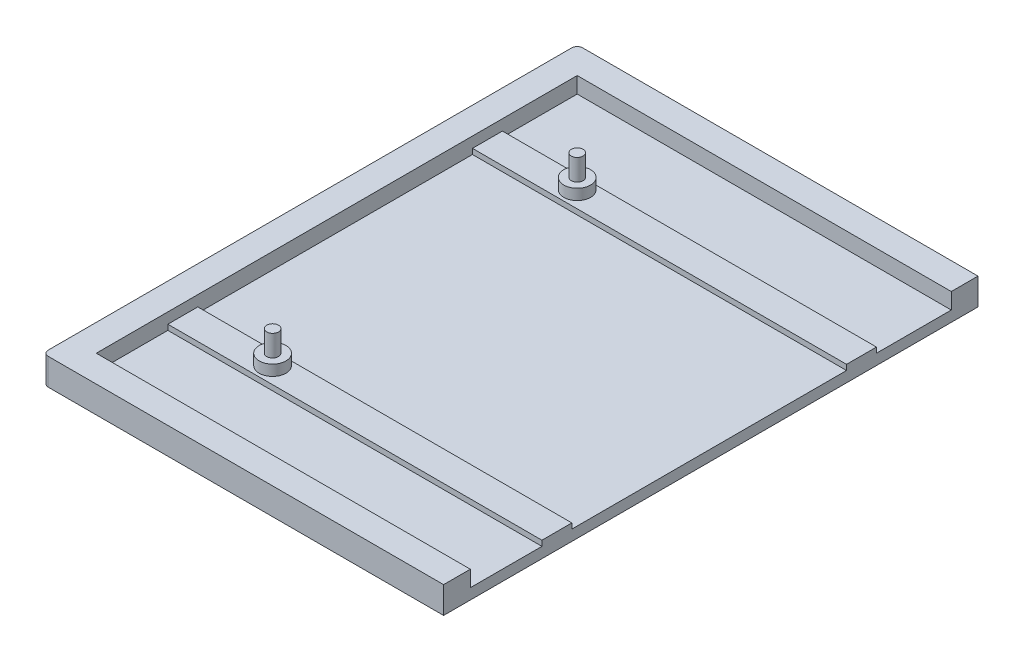
ISO-10303-21;
HEADER;
FILE_DESCRIPTION(('STEP AP214'),'2;1');
FILE_NAME('part.step','',(''),(''),'','','');
FILE_SCHEMA(('AUTOMOTIVE_DESIGN { 1 0 10303 214 1 1 1 1 }'));
ENDSEC;
DATA;
#1=APPLICATION_CONTEXT('core data for automotive mechanical design processes');
#2=APPLICATION_PROTOCOL_DEFINITION('international standard','automotive_design',2000,#1);
#3=PRODUCT_CONTEXT('',#1,'mechanical');
#4=PRODUCT('Part','Part','',(#3));
#5=PRODUCT_RELATED_PRODUCT_CATEGORY('part','',(#4));
#6=PRODUCT_DEFINITION_FORMATION('','',#4);
#7=PRODUCT_DEFINITION_CONTEXT('part definition',#1,'design');
#8=PRODUCT_DEFINITION('design','',#6,#7);
#9=PRODUCT_DEFINITION_SHAPE('','',#8);
#10=(LENGTH_UNIT() NAMED_UNIT(*) SI_UNIT(.MILLI.,.METRE.));
#11=(NAMED_UNIT(*) PLANE_ANGLE_UNIT() SI_UNIT($,.RADIAN.));
#12=(NAMED_UNIT(*) SI_UNIT($,.STERADIAN.) SOLID_ANGLE_UNIT());
#13=UNCERTAINTY_MEASURE_WITH_UNIT(LENGTH_MEASURE(1.E-05),#10,'distance_accuracy_value','');
#14=(GEOMETRIC_REPRESENTATION_CONTEXT(3) GLOBAL_UNCERTAINTY_ASSIGNED_CONTEXT((#13)) GLOBAL_UNIT_ASSIGNED_CONTEXT((#10,
#11,#12)) REPRESENTATION_CONTEXT('',''));
#15=CARTESIAN_POINT('',(0.,0.,0.));
#16=DIRECTION('',(0.,0.,1.));
#17=DIRECTION('',(1.,0.,0.));
#18=AXIS2_PLACEMENT_3D('',#15,#16,#17);
#19=CARTESIAN_POINT('',(124.126441540026,0.,0.));
#20=DIRECTION('',(-1.,0.,0.));
#21=DIRECTION('',(0.,0.,1.));
#22=AXIS2_PLACEMENT_3D('',#19,#20,#21);
#23=PLANE('',#22);
#24=DIRECTION('',(0.,-1.,0.));
#25=VECTOR('',#24,1.);
#26=CARTESIAN_POINT('',(124.126441540026,5.,-248.405238280515));
#27=LINE('',#26,#25);
#28=CARTESIAN_POINT('',(124.126441540026,5.,-248.405238280515));
#29=VERTEX_POINT('',#28);
#30=CARTESIAN_POINT('',(124.126441540026,0.,-248.405238280515));
#31=VERTEX_POINT('',#30);
#32=EDGE_CURVE('E313',#29,#31,#27,.T.);
#33=ORIENTED_EDGE('',*,*,#32,.F.);
#34=DIRECTION('',(0.,0.,1.));
#35=VECTOR('',#34,1.);
#36=CARTESIAN_POINT('',(124.126441540026,5.,0.));
#37=LINE('',#36,#35);
#38=CARTESIAN_POINT('',(124.126441540026,5.,-243.405238280515));
#39=VERTEX_POINT('',#38);
#40=EDGE_CURVE('E309',#29,#39,#37,.T.);
#41=ORIENTED_EDGE('',*,*,#40,.T.);
#42=DIRECTION('',(0.,-1.,0.));
#43=VECTOR('',#42,1.);
#44=CARTESIAN_POINT('',(124.126441540026,5.,-243.405238280515));
#45=LINE('',#44,#43);
#46=CARTESIAN_POINT('',(124.126441540026,2.,-243.405238280515));
#47=VERTEX_POINT('',#46);
#48=EDGE_CURVE('E306',#39,#47,#45,.T.);
#49=ORIENTED_EDGE('',*,*,#48,.T.);
#50=DIRECTION('',(0.,0.,1.));
#51=VECTOR('',#50,1.);
#52=CARTESIAN_POINT('',(124.126441540026,2.,0.));
#53=LINE('',#52,#51);
#54=CARTESIAN_POINT('',(124.126441540026,2.,-229.405435317784));
#55=VERTEX_POINT('',#54);
#56=EDGE_CURVE('E302',#47,#55,#53,.T.);
#57=ORIENTED_EDGE('',*,*,#56,.T.);
#58=DIRECTION('',(0.,-1.,0.));
#59=VECTOR('',#58,1.);
#60=CARTESIAN_POINT('',(124.126441540026,3.,-229.405435317784));
#61=LINE('',#60,#59);
#62=CARTESIAN_POINT('',(124.126441540026,3.,-229.405435317784));
#63=VERTEX_POINT('',#62);
#64=EDGE_CURVE('E292',#63,#55,#61,.T.);
#65=ORIENTED_EDGE('',*,*,#64,.F.);
#66=DIRECTION('',(0.,0.,-1.));
#67=VECTOR('',#66,1.);
#68=CARTESIAN_POINT('',(124.126441540026,3.,0.));
#69=LINE('',#68,#67);
#70=CARTESIAN_POINT('',(124.126441540026,3.,-223.805428582459));
#71=VERTEX_POINT('',#70);
#72=EDGE_CURVE('E293',#71,#63,#69,.T.);
#73=ORIENTED_EDGE('',*,*,#72,.F.);
#74=DIRECTION('',(0.,1.,0.));
#75=VECTOR('',#74,1.);
#76=CARTESIAN_POINT('',(124.126441540026,3.,-223.805428582459));
#77=LINE('',#76,#75);
#78=CARTESIAN_POINT('',(124.126441540026,2.,-223.805428582459));
#79=VERTEX_POINT('',#78);
#80=EDGE_CURVE('E286',#79,#71,#77,.T.);
#81=ORIENTED_EDGE('',*,*,#80,.F.);
#82=DIRECTION('',(0.,0.,1.));
#83=VECTOR('',#82,1.);
#84=CARTESIAN_POINT('',(124.126441540026,2.,0.));
#85=LINE('',#84,#83);
#86=CARTESIAN_POINT('',(124.126441540026,2.,-172.405304582281));
#87=VERTEX_POINT('',#86);
#88=EDGE_CURVE('E11',#79,#87,#85,.T.);
#89=ORIENTED_EDGE('',*,*,#88,.T.);
#90=DIRECTION('',(0.,-1.,0.));
#91=VECTOR('',#90,1.);
#92=CARTESIAN_POINT('',(124.126441540026,3.,-172.405304582281));
#93=LINE('',#92,#91);
#94=CARTESIAN_POINT('',(124.126441540026,3.,-172.405304582281));
#95=VERTEX_POINT('',#94);
#96=EDGE_CURVE('E59',#95,#87,#93,.T.);
#97=ORIENTED_EDGE('',*,*,#96,.F.);
#98=DIRECTION('',(0.,0.,-1.));
#99=VECTOR('',#98,1.);
#100=CARTESIAN_POINT('',(124.126441540026,3.,0.));
#101=LINE('',#100,#99);
#102=CARTESIAN_POINT('',(124.126441540026,3.,-166.805313068658));
#103=VERTEX_POINT('',#102);
#104=EDGE_CURVE('E174',#103,#95,#101,.T.);
#105=ORIENTED_EDGE('',*,*,#104,.F.);
#106=DIRECTION('',(0.,1.,0.));
#107=VECTOR('',#106,1.);
#108=CARTESIAN_POINT('',(124.126441540026,3.,-166.805313068658));
#109=LINE('',#108,#107);
#110=CARTESIAN_POINT('',(124.126441540026,2.,-166.805313068658));
#111=VERTEX_POINT('',#110);
#112=EDGE_CURVE('E296',#111,#103,#109,.T.);
#113=ORIENTED_EDGE('',*,*,#112,.F.);
#114=DIRECTION('',(0.,0.,1.));
#115=VECTOR('',#114,1.);
#116=CARTESIAN_POINT('',(124.126441540026,2.,0.));
#117=LINE('',#116,#115);
#118=CARTESIAN_POINT('',(124.126441540026,2.,-153.405153415137));
#119=VERTEX_POINT('',#118);
#120=EDGE_CURVE('E45',#111,#119,#117,.T.);
#121=ORIENTED_EDGE('',*,*,#120,.T.);
#122=DIRECTION('',(0.,1.,0.));
#123=VECTOR('',#122,1.);
#124=CARTESIAN_POINT('',(124.126441540026,5.,-153.405153415137));
#125=LINE('',#124,#123);
#126=CARTESIAN_POINT('',(124.126441540026,5.,-153.405153415137));
#127=VERTEX_POINT('',#126);
#128=EDGE_CURVE('E310',#119,#127,#125,.T.);
#129=ORIENTED_EDGE('',*,*,#128,.T.);
#130=CARTESIAN_POINT('',(124.126441540026,5.,-148.405152672559));
#131=VERTEX_POINT('',#130);
#132=EDGE_CURVE('E305',#127,#131,#37,.T.);
#133=ORIENTED_EDGE('',*,*,#132,.T.);
#134=DIRECTION('',(0.,1.,0.));
#135=VECTOR('',#134,1.);
#136=CARTESIAN_POINT('',(124.126441540026,5.,-148.405152672559));
#137=LINE('',#136,#135);
#138=CARTESIAN_POINT('',(124.126441540026,0.,-148.405152672559));
#139=VERTEX_POINT('',#138);
#140=EDGE_CURVE('E316',#139,#131,#137,.T.);
#141=ORIENTED_EDGE('',*,*,#140,.F.);
#142=DIRECTION('',(0.,0.,1.));
#143=VECTOR('',#142,1.);
#144=CARTESIAN_POINT('',(124.126441540026,0.,0.));
#145=LINE('',#144,#143);
#146=EDGE_CURVE('E40',#31,#139,#145,.T.);
#147=ORIENTED_EDGE('',*,*,#146,.F.);
#148=EDGE_LOOP('',(#33,#41,#49,#57,#65,#73,#81,#89,#97,#105,#113,#121,#129,#133,#141,#147));
#149=FACE_BOUND('',#148,.T.);
#150=ADVANCED_FACE('F37',(#149),#23,.F.);
#151=CARTESIAN_POINT('',(0.,5.,-148.405152672559));
#152=DIRECTION('',(0.,0.,-1.));
#153=DIRECTION('',(-1.,0.,0.));
#154=AXIS2_PLACEMENT_3D('',#151,#152,#153);
#155=PLANE('',#154);
#156=DIRECTION('',(1.,0.,0.));
#157=VECTOR('',#156,1.);
#158=CARTESIAN_POINT('',(0.,0.,-148.405152672559));
#159=LINE('',#158,#157);
#160=CARTESIAN_POINT('',(50.1424415400261,0.,-148.405152672559));
#161=VERTEX_POINT('',#160);
#162=EDGE_CURVE('E267',#161,#139,#159,.T.);
#163=ORIENTED_EDGE('',*,*,#162,.T.);
#164=ORIENTED_EDGE('',*,*,#140,.T.);
#165=DIRECTION('',(1.,0.,0.));
#166=VECTOR('',#165,1.);
#167=CARTESIAN_POINT('',(0.,5.,-148.405152672559));
#168=LINE('',#167,#166);
#169=CARTESIAN_POINT('',(50.1424415400261,5.,-148.405152672559));
#170=VERTEX_POINT('',#169);
#171=EDGE_CURVE('E255',#170,#131,#168,.T.);
#172=ORIENTED_EDGE('',*,*,#171,.F.);
#173=DIRECTION('',(0.,-1.,0.));
#174=VECTOR('',#173,1.);
#175=CARTESIAN_POINT('',(50.1424415400261,5.,-148.405152672559));
#176=LINE('',#175,#174);
#177=EDGE_CURVE('E280',#170,#161,#176,.T.);
#178=ORIENTED_EDGE('',*,*,#177,.T.);
#179=EDGE_LOOP('',(#163,#164,#172,#178));
#180=FACE_BOUND('',#179,.T.);
#181=ADVANCED_FACE('F386',(#180),#155,.F.);
#182=CARTESIAN_POINT('',(0.,5.,-153.405153415137));
#183=DIRECTION('',(0.,0.,-1.));
#184=DIRECTION('',(-1.,0.,0.));
#185=AXIS2_PLACEMENT_3D('',#182,#183,#184);
#186=PLANE('',#185);
#187=ORIENTED_EDGE('',*,*,#128,.F.);
#188=DIRECTION('',(1.,0.,0.));
#189=VECTOR('',#188,1.);
#190=CARTESIAN_POINT('',(0.,2.,-153.405153415137));
#191=LINE('',#190,#189);
#192=CARTESIAN_POINT('',(54.1264415400261,2.,-153.405153415137));
#193=VERTEX_POINT('',#192);
#194=EDGE_CURVE('E217',#193,#119,#191,.T.);
#195=ORIENTED_EDGE('',*,*,#194,.F.);
#196=DIRECTION('',(0.,-1.,0.));
#197=VECTOR('',#196,1.);
#198=CARTESIAN_POINT('',(54.1264415400261,5.,-153.405153415137));
#199=LINE('',#198,#197);
#200=CARTESIAN_POINT('',(54.1264415400261,5.,-153.405153415137));
#201=VERTEX_POINT('',#200);
#202=EDGE_CURVE('E277',#201,#193,#199,.T.);
#203=ORIENTED_EDGE('',*,*,#202,.F.);
#204=DIRECTION('',(1.,0.,0.));
#205=VECTOR('',#204,1.);
#206=CARTESIAN_POINT('',(0.,5.,-153.405153415137));
#207=LINE('',#206,#205);
#208=EDGE_CURVE('E241',#201,#127,#207,.T.);
#209=ORIENTED_EDGE('',*,*,#208,.T.);
#210=EDGE_LOOP('',(#187,#195,#203,#209));
#211=FACE_BOUND('',#210,.T.);
#212=ADVANCED_FACE('F382',(#211),#186,.T.);
#213=CARTESIAN_POINT('',(0.,5.,0.));
#214=DIRECTION('',(0.,1.,0.));
#215=DIRECTION('',(0.,0.,1.));
#216=AXIS2_PLACEMENT_3D('',#213,#214,#215);
#217=PLANE('',#216);
#218=ORIENTED_EDGE('',*,*,#40,.F.);
#219=DIRECTION('',(-1.,0.,1.90461469313681E-08));
#220=VECTOR('',#219,1.);
#221=CARTESIAN_POINT('',(-4.73116262178461E-06,5.,-248.405235916384));
#222=LINE('',#221,#220);
#223=CARTESIAN_POINT('',(50.1424408346779,5.,-248.405236871404));
#224=VERTEX_POINT('',#223);
#225=EDGE_CURVE('E258',#29,#224,#222,.T.);
#226=ORIENTED_EDGE('',*,*,#225,.T.);
#227=CARTESIAN_POINT('',(50.1424415400093,5.,-247.389236871405));
#228=DIRECTION('',(0.,1.,0.));
#229=DIRECTION('',(0.,0.,1.));
#230=AXIS2_PLACEMENT_3D('',#227,#228,#229);
#231=CIRCLE('',#230,1.01600000000002);
#232=CARTESIAN_POINT('',(49.1264415400261,5.,-247.389242717958));
#233=VERTEX_POINT('',#232);
#234=EDGE_CURVE('E260',#224,#233,#231,.T.);
#235=ORIENTED_EDGE('',*,*,#234,.T.);
#236=DIRECTION('',(0.,0.,1.));
#237=VECTOR('',#236,1.);
#238=CARTESIAN_POINT('',(49.1264415400262,5.,0.));
#239=LINE('',#238,#237);
#240=CARTESIAN_POINT('',(49.1264415400261,5.,-149.421152672559));
#241=VERTEX_POINT('',#240);
#242=EDGE_CURVE('E250',#233,#241,#239,.T.);
#243=ORIENTED_EDGE('',*,*,#242,.T.);
#244=CARTESIAN_POINT('',(50.1424415400261,5.,-149.421152672559));
#245=DIRECTION('',(0.,1.,0.));
#246=DIRECTION('',(0.,0.,1.));
#247=AXIS2_PLACEMENT_3D('',#244,#245,#246);
#248=CIRCLE('',#247,1.01600000000002);
#249=EDGE_CURVE('E253',#241,#170,#248,.T.);
#250=ORIENTED_EDGE('',*,*,#249,.T.);
#251=ORIENTED_EDGE('',*,*,#171,.T.);
#252=ORIENTED_EDGE('',*,*,#132,.F.);
#253=ORIENTED_EDGE('',*,*,#208,.F.);
#254=DIRECTION('',(0.,0.,1.));
#255=VECTOR('',#254,1.);
#256=CARTESIAN_POINT('',(54.1264415400261,5.,0.));
#257=LINE('',#256,#255);
#258=CARTESIAN_POINT('',(54.1264415400261,5.,-243.405236947284));
#259=VERTEX_POINT('',#258);
#260=EDGE_CURVE('E244',#259,#201,#257,.T.);
#261=ORIENTED_EDGE('',*,*,#260,.F.);
#262=DIRECTION('',(-1.,0.,1.90461465885209E-08));
#263=VECTOR('',#262,1.);
#264=CARTESIAN_POINT('',(-4.63593180367697E-06,5.,-243.405235916384));
#265=LINE('',#264,#263);
#266=EDGE_CURVE('E248',#39,#259,#265,.T.);
#267=ORIENTED_EDGE('',*,*,#266,.F.);
#268=EDGE_LOOP('',(#218,#226,#235,#243,#250,#251,#252,#253,#261,#267));
#269=FACE_BOUND('',#268,.T.);
#270=ADVANCED_FACE('F341',(#269),#217,.T.);
#271=CARTESIAN_POINT('',(0.,0.,0.));
#272=DIRECTION('',(0.,1.,0.));
#273=DIRECTION('',(0.,0.,1.));
#274=AXIS2_PLACEMENT_3D('',#271,#272,#273);
#275=PLANE('',#274);
#276=DIRECTION('',(-1.,0.,1.90461469313681E-08));
#277=VECTOR('',#276,1.);
#278=CARTESIAN_POINT('',(-4.73116262178461E-06,0.,-248.405235916384));
#279=LINE('',#278,#277);
#280=CARTESIAN_POINT('',(50.1424408346779,0.,-248.405236871404));
#281=VERTEX_POINT('',#280);
#282=EDGE_CURVE('E270',#31,#281,#279,.T.);
#283=ORIENTED_EDGE('',*,*,#282,.F.);
#284=ORIENTED_EDGE('',*,*,#146,.T.);
#285=ORIENTED_EDGE('',*,*,#162,.F.);
#286=CARTESIAN_POINT('',(50.1424415400261,0.,-149.421152672559));
#287=DIRECTION('',(0.,1.,0.));
#288=DIRECTION('',(0.,0.,1.));
#289=AXIS2_PLACEMENT_3D('',#286,#287,#288);
#290=CIRCLE('',#289,1.01600000000002);
#291=CARTESIAN_POINT('',(49.1264415400261,0.,-149.421152672559));
#292=VERTEX_POINT('',#291);
#293=EDGE_CURVE('E265',#292,#161,#290,.T.);
#294=ORIENTED_EDGE('',*,*,#293,.F.);
#295=DIRECTION('',(0.,0.,1.));
#296=VECTOR('',#295,1.);
#297=CARTESIAN_POINT('',(49.1264415400262,0.,0.));
#298=LINE('',#297,#296);
#299=CARTESIAN_POINT('',(49.1264415400261,0.,-247.389242717958));
#300=VERTEX_POINT('',#299);
#301=EDGE_CURVE('E239',#300,#292,#298,.T.);
#302=ORIENTED_EDGE('',*,*,#301,.F.);
#303=CARTESIAN_POINT('',(50.1424415400093,0.,-247.389236871405));
#304=DIRECTION('',(0.,1.,0.));
#305=DIRECTION('',(0.,0.,1.));
#306=AXIS2_PLACEMENT_3D('',#303,#304,#305);
#307=CIRCLE('',#306,1.01600000000002);
#308=EDGE_CURVE('E245',#281,#300,#307,.T.);
#309=ORIENTED_EDGE('',*,*,#308,.F.);
#310=EDGE_LOOP('',(#283,#284,#285,#294,#302,#309));
#311=FACE_BOUND('',#310,.T.);
#312=ADVANCED_FACE('F328',(#311),#275,.F.);
#313=CARTESIAN_POINT('',(0.,3.,0.));
#314=DIRECTION('',(0.,-1.,0.));
#315=DIRECTION('',(0.,0.,-1.));
#316=AXIS2_PLACEMENT_3D('',#313,#314,#315);
#317=PLANE('',#316);
#318=DIRECTION('',(1.,0.,0.));
#319=VECTOR('',#318,1.);
#320=CARTESIAN_POINT('',(353.126212345323,3.,-166.805313068658));
#321=LINE('',#320,#319);
#322=CARTESIAN_POINT('',(54.1264415400261,3.,-166.805313068658));
#323=VERTEX_POINT('',#322);
#324=EDGE_CURVE('E191',#323,#103,#321,.T.);
#325=ORIENTED_EDGE('',*,*,#324,.T.);
#326=ORIENTED_EDGE('',*,*,#104,.T.);
#327=DIRECTION('',(-1.,0.,0.));
#328=VECTOR('',#327,1.);
#329=CARTESIAN_POINT('',(54.1264415400261,3.,-172.405304582281));
#330=LINE('',#329,#328);
#331=CARTESIAN_POINT('',(70.6262489401997,3.,-172.405304582281));
#332=VERTEX_POINT('',#331);
#333=EDGE_CURVE('E167',#95,#332,#330,.T.);
#334=ORIENTED_EDGE('',*,*,#333,.T.);
#335=CARTESIAN_POINT('',(70.6262489401997,3.,-169.905304582281));
#336=DIRECTION('',(0.,-1.,0.));
#337=DIRECTION('',(0.,0.,-1.));
#338=AXIS2_PLACEMENT_3D('',#335,#336,#337);
#339=CIRCLE('',#338,2.5);
#340=EDGE_CURVE('E172',#332,#332,#339,.F.);
#341=ORIENTED_EDGE('',*,*,#340,.F.);
#342=CARTESIAN_POINT('',(54.1264415400261,3.,-172.405304582281));
#343=VERTEX_POINT('',#342);
#344=EDGE_CURVE('E176',#332,#343,#330,.T.);
#345=ORIENTED_EDGE('',*,*,#344,.T.);
#346=DIRECTION('',(0.,0.,1.));
#347=VECTOR('',#346,1.);
#348=CARTESIAN_POINT('',(54.1264415400261,3.,-166.805313068658));
#349=LINE('',#348,#347);
#350=EDGE_CURVE('E175',#343,#323,#349,.T.);
#351=ORIENTED_EDGE('',*,*,#350,.T.);
#352=EDGE_LOOP('',(#325,#326,#334,#341,#345,#351));
#353=FACE_BOUND('',#352,.T.);
#354=ADVANCED_FACE('F170',(#353),#317,.F.);
#355=CARTESIAN_POINT('',(353.126212345323,3.,-166.805313068658));
#356=DIRECTION('',(0.,0.,-1.));
#357=DIRECTION('',(-1.,0.,0.));
#358=AXIS2_PLACEMENT_3D('',#355,#356,#357);
#359=PLANE('',#358);
#360=DIRECTION('',(1.,0.,0.));
#361=VECTOR('',#360,1.);
#362=CARTESIAN_POINT('',(353.126212345323,2.,-166.805313068658));
#363=LINE('',#362,#361);
#364=CARTESIAN_POINT('',(54.1264415400261,2.,-166.805313068658));
#365=VERTEX_POINT('',#364);
#366=EDGE_CURVE('E183',#365,#111,#363,.T.);
#367=ORIENTED_EDGE('',*,*,#366,.T.);
#368=ORIENTED_EDGE('',*,*,#112,.T.);
#369=ORIENTED_EDGE('',*,*,#324,.F.);
#370=DIRECTION('',(0.,-1.,0.));
#371=VECTOR('',#370,1.);
#372=CARTESIAN_POINT('',(54.1264415400261,3.,-166.805313068658));
#373=LINE('',#372,#371);
#374=EDGE_CURVE('E193',#323,#365,#373,.T.);
#375=ORIENTED_EDGE('',*,*,#374,.T.);
#376=EDGE_LOOP('',(#367,#368,#369,#375));
#377=FACE_BOUND('',#376,.T.);
#378=ADVANCED_FACE('F376',(#377),#359,.F.);
#379=CARTESIAN_POINT('',(54.1264415400261,3.,-172.405304582281));
#380=DIRECTION('',(0.,0.,1.));
#381=DIRECTION('',(1.,0.,0.));
#382=AXIS2_PLACEMENT_3D('',#379,#380,#381);
#383=PLANE('',#382);
#384=ORIENTED_EDGE('',*,*,#333,.F.);
#385=ORIENTED_EDGE('',*,*,#96,.T.);
#386=DIRECTION('',(-1.,0.,0.));
#387=VECTOR('',#386,1.);
#388=CARTESIAN_POINT('',(54.1264415400261,2.,-172.405304582281));
#389=LINE('',#388,#387);
#390=CARTESIAN_POINT('',(54.1264415400261,2.,-172.405304582281));
#391=VERTEX_POINT('',#390);
#392=EDGE_CURVE('E185',#87,#391,#389,.T.);
#393=ORIENTED_EDGE('',*,*,#392,.T.);
#394=DIRECTION('',(0.,-1.,0.));
#395=VECTOR('',#394,1.);
#396=CARTESIAN_POINT('',(54.1264415400261,3.,-172.405304582281));
#397=LINE('',#396,#395);
#398=EDGE_CURVE('E181',#343,#391,#397,.T.);
#399=ORIENTED_EDGE('',*,*,#398,.F.);
#400=ORIENTED_EDGE('',*,*,#344,.F.);
#401=EDGE_LOOP('',(#384,#385,#393,#399,#400));
#402=FACE_BOUND('',#401,.T.);
#403=ADVANCED_FACE('F179',(#402),#383,.F.);
#404=CARTESIAN_POINT('',(0.,2.,0.));
#405=DIRECTION('',(0.,1.,0.));
#406=DIRECTION('',(0.,0.,1.));
#407=AXIS2_PLACEMENT_3D('',#404,#405,#406);
#408=PLANE('',#407);
#409=ORIENTED_EDGE('',*,*,#120,.F.);
#410=ORIENTED_EDGE('',*,*,#366,.F.);
#411=DIRECTION('',(0.,0.,1.));
#412=VECTOR('',#411,1.);
#413=CARTESIAN_POINT('',(54.1264415400261,2.,0.));
#414=LINE('',#413,#412);
#415=EDGE_CURVE('E235',#365,#193,#414,.T.);
#416=ORIENTED_EDGE('',*,*,#415,.T.);
#417=ORIENTED_EDGE('',*,*,#194,.T.);
#418=EDGE_LOOP('',(#409,#410,#416,#417));
#419=FACE_BOUND('',#418,.T.);
#420=ADVANCED_FACE('F380',(#419),#408,.T.);
#421=ORIENTED_EDGE('',*,*,#88,.F.);
#422=DIRECTION('',(1.,0.,0.));
#423=VECTOR('',#422,1.);
#424=CARTESIAN_POINT('',(54.1264415400261,2.,-223.805428582459));
#425=LINE('',#424,#423);
#426=CARTESIAN_POINT('',(54.1264415400261,2.,-223.805428582459));
#427=VERTEX_POINT('',#426);
#428=EDGE_CURVE('E213',#427,#79,#425,.T.);
#429=ORIENTED_EDGE('',*,*,#428,.F.);
#430=EDGE_CURVE('E240',#427,#391,#414,.T.);
#431=ORIENTED_EDGE('',*,*,#430,.T.);
#432=ORIENTED_EDGE('',*,*,#392,.F.);
#433=EDGE_LOOP('',(#421,#429,#431,#432));
#434=FACE_BOUND('',#433,.T.);
#435=ADVANCED_FACE('F372',(#434),#408,.T.);
#436=CARTESIAN_POINT('',(-4.73116262178461E-06,5.,-248.405235916384));
#437=DIRECTION('',(1.90461469313681E-08,0.,1.));
#438=DIRECTION('',(1.,0.,-1.90461469313681E-08));
#439=AXIS2_PLACEMENT_3D('',#436,#437,#438);
#440=PLANE('',#439);
#441=ORIENTED_EDGE('',*,*,#225,.F.);
#442=ORIENTED_EDGE('',*,*,#32,.T.);
#443=ORIENTED_EDGE('',*,*,#282,.T.);
#444=DIRECTION('',(0.,-1.,0.));
#445=VECTOR('',#444,1.);
#446=CARTESIAN_POINT('',(50.1424408346779,5.,-248.405236871404));
#447=LINE('',#446,#445);
#448=EDGE_CURVE('E276',#224,#281,#447,.T.);
#449=ORIENTED_EDGE('',*,*,#448,.F.);
#450=EDGE_LOOP('',(#441,#442,#443,#449));
#451=FACE_BOUND('',#450,.T.);
#452=ADVANCED_FACE('F322',(#451),#440,.F.);
#453=CARTESIAN_POINT('',(49.1264415400262,5.,0.));
#454=DIRECTION('',(1.,0.,0.));
#455=DIRECTION('',(0.,0.,-1.));
#456=AXIS2_PLACEMENT_3D('',#453,#454,#455);
#457=PLANE('',#456);
#458=ORIENTED_EDGE('',*,*,#301,.T.);
#459=DIRECTION('',(0.,-1.,0.));
#460=VECTOR('',#459,1.);
#461=CARTESIAN_POINT('',(49.1264415400261,5.,-149.421152672559));
#462=LINE('',#461,#460);
#463=EDGE_CURVE('E283',#241,#292,#462,.T.);
#464=ORIENTED_EDGE('',*,*,#463,.F.);
#465=ORIENTED_EDGE('',*,*,#242,.F.);
#466=DIRECTION('',(0.,-1.,0.));
#467=VECTOR('',#466,1.);
#468=CARTESIAN_POINT('',(49.1264415400261,5.,-247.389242717958));
#469=LINE('',#468,#467);
#470=EDGE_CURVE('E273',#233,#300,#469,.T.);
#471=ORIENTED_EDGE('',*,*,#470,.T.);
#472=EDGE_LOOP('',(#458,#464,#465,#471));
#473=FACE_BOUND('',#472,.T.);
#474=ADVANCED_FACE('F338',(#473),#457,.F.);
#475=CARTESIAN_POINT('',(50.1424415400261,5.,-149.421152672559));
#476=DIRECTION('',(0.,-1.,0.));
#477=DIRECTION('',(0.,0.,-1.));
#478=AXIS2_PLACEMENT_3D('',#475,#476,#477);
#479=CYLINDRICAL_SURFACE('',#478,1.01600000000002);
#480=ORIENTED_EDGE('',*,*,#293,.T.);
#481=ORIENTED_EDGE('',*,*,#177,.F.);
#482=ORIENTED_EDGE('',*,*,#249,.F.);
#483=ORIENTED_EDGE('',*,*,#463,.T.);
#484=EDGE_LOOP('',(#480,#481,#482,#483));
#485=FACE_BOUND('',#484,.T.);
#486=ADVANCED_FACE('F388',(#485),#479,.T.);
#487=CARTESIAN_POINT('',(54.1264415400261,5.,0.));
#488=DIRECTION('',(1.,0.,0.));
#489=DIRECTION('',(0.,0.,-1.));
#490=AXIS2_PLACEMENT_3D('',#487,#488,#489);
#491=PLANE('',#490);
#492=ORIENTED_EDGE('',*,*,#415,.F.);
#493=ORIENTED_EDGE('',*,*,#374,.F.);
#494=ORIENTED_EDGE('',*,*,#350,.F.);
#495=ORIENTED_EDGE('',*,*,#398,.T.);
#496=ORIENTED_EDGE('',*,*,#430,.F.);
#497=DIRECTION('',(0.,-1.,0.));
#498=VECTOR('',#497,1.);
#499=CARTESIAN_POINT('',(54.1264415400261,3.,-223.805428582459));
#500=LINE('',#499,#498);
#501=CARTESIAN_POINT('',(54.1264415400261,3.,-223.805428582459));
#502=VERTEX_POINT('',#501);
#503=EDGE_CURVE('E210',#502,#427,#500,.T.);
#504=ORIENTED_EDGE('',*,*,#503,.F.);
#505=DIRECTION('',(0.,0.,1.));
#506=VECTOR('',#505,1.);
#507=CARTESIAN_POINT('',(54.1264415400261,3.,-223.805428582459));
#508=LINE('',#507,#506);
#509=CARTESIAN_POINT('',(54.1264415400261,3.,-229.405435317784));
#510=VERTEX_POINT('',#509);
#511=EDGE_CURVE('E219',#510,#502,#508,.T.);
#512=ORIENTED_EDGE('',*,*,#511,.F.);
#513=DIRECTION('',(0.,-1.,0.));
#514=VECTOR('',#513,1.);
#515=CARTESIAN_POINT('',(54.1264415400261,3.,-229.405435317784));
#516=LINE('',#515,#514);
#517=CARTESIAN_POINT('',(54.1264415400261,2.,-229.405435317784));
#518=VERTEX_POINT('',#517);
#519=EDGE_CURVE('E214',#510,#518,#516,.T.);
#520=ORIENTED_EDGE('',*,*,#519,.T.);
#521=CARTESIAN_POINT('',(54.1264415400261,2.,-243.405236947284));
#522=VERTEX_POINT('',#521);
#523=EDGE_CURVE('E236',#522,#518,#414,.T.);
#524=ORIENTED_EDGE('',*,*,#523,.F.);
#525=DIRECTION('',(0.,-1.,0.));
#526=VECTOR('',#525,1.);
#527=CARTESIAN_POINT('',(54.1264415400261,5.,-243.405236947284));
#528=LINE('',#527,#526);
#529=EDGE_CURVE('E262',#259,#522,#528,.T.);
#530=ORIENTED_EDGE('',*,*,#529,.F.);
#531=ORIENTED_EDGE('',*,*,#260,.T.);
#532=ORIENTED_EDGE('',*,*,#202,.T.);
#533=EDGE_LOOP('',(#492,#493,#494,#495,#496,#504,#512,#520,#524,#530,#531,#532));
#534=FACE_BOUND('',#533,.T.);
#535=ADVANCED_FACE('F356',(#534),#491,.T.);
#536=CARTESIAN_POINT('',(-4.63593180367697E-06,5.,-243.405235916384));
#537=DIRECTION('',(1.90461465885209E-08,0.,1.));
#538=DIRECTION('',(1.,0.,-1.90461465885209E-08));
#539=AXIS2_PLACEMENT_3D('',#536,#537,#538);
#540=PLANE('',#539);
#541=ORIENTED_EDGE('',*,*,#48,.F.);
#542=ORIENTED_EDGE('',*,*,#266,.T.);
#543=ORIENTED_EDGE('',*,*,#529,.T.);
#544=DIRECTION('',(-1.,0.,1.90461465885209E-08));
#545=VECTOR('',#544,1.);
#546=CARTESIAN_POINT('',(-4.63593180367697E-06,2.,-243.405235916384));
#547=LINE('',#546,#545);
#548=EDGE_CURVE('E233',#47,#522,#547,.T.);
#549=ORIENTED_EDGE('',*,*,#548,.F.);
#550=EDGE_LOOP('',(#541,#542,#543,#549));
#551=FACE_BOUND('',#550,.T.);
#552=ADVANCED_FACE('F349',(#551),#540,.T.);
#553=CARTESIAN_POINT('',(50.1424415400093,5.,-247.389236871405));
#554=DIRECTION('',(0.,-1.,0.));
#555=DIRECTION('',(0.,0.,-1.));
#556=AXIS2_PLACEMENT_3D('',#553,#554,#555);
#557=CYLINDRICAL_SURFACE('',#556,1.01600000000002);
#558=ORIENTED_EDGE('',*,*,#308,.T.);
#559=ORIENTED_EDGE('',*,*,#470,.F.);
#560=ORIENTED_EDGE('',*,*,#234,.F.);
#561=ORIENTED_EDGE('',*,*,#448,.T.);
#562=EDGE_LOOP('',(#558,#559,#560,#561));
#563=FACE_BOUND('',#562,.T.);
#564=ADVANCED_FACE('F334',(#563),#557,.T.);
#565=CARTESIAN_POINT('',(0.,9.,0.));
#566=DIRECTION('',(0.,1.,0.));
#567=DIRECTION('',(0.,0.,1.));
#568=AXIS2_PLACEMENT_3D('',#565,#566,#567);
#569=PLANE('',#568);
#570=CARTESIAN_POINT('',(70.6262489401997,9.,-169.905304582281));
#571=DIRECTION('',(0.,1.,0.));
#572=DIRECTION('',(0.,0.,1.));
#573=AXIS2_PLACEMENT_3D('',#570,#571,#572);
#574=CIRCLE('',#573,1.09999999999999);
#575=CARTESIAN_POINT('',(70.6262489401997,9.,-168.805304582281));
#576=VERTEX_POINT('',#575);
#577=EDGE_CURVE('E758',#576,#576,#574,.T.);
#578=ORIENTED_EDGE('',*,*,#577,.T.);
#579=EDGE_LOOP('',(#578));
#580=FACE_BOUND('',#579,.T.);
#581=ADVANCED_FACE('F420',(#580),#569,.T.);
#582=CARTESIAN_POINT('',(70.6262489401997,9.,-169.905304582281));
#583=DIRECTION('',(0.,-1.,0.));
#584=DIRECTION('',(0.,0.,-1.));
#585=AXIS2_PLACEMENT_3D('',#582,#583,#584);
#586=CYLINDRICAL_SURFACE('',#585,1.09999999999999);
#587=ORIENTED_EDGE('',*,*,#577,.F.);
#588=EDGE_LOOP('',(#587));
#589=FACE_BOUND('',#588,.T.);
#590=CARTESIAN_POINT('',(70.6262489401997,5.,-169.905304582281));
#591=DIRECTION('',(0.,1.,0.));
#592=DIRECTION('',(0.,0.,1.));
#593=AXIS2_PLACEMENT_3D('',#590,#591,#592);
#594=CIRCLE('',#593,1.09999999999999);
#595=CARTESIAN_POINT('',(70.6262489401997,5.,-168.805304582281));
#596=VERTEX_POINT('',#595);
#597=EDGE_CURVE('E755',#596,#596,#594,.T.);
#598=ORIENTED_EDGE('',*,*,#597,.T.);
#599=EDGE_LOOP('',(#598));
#600=FACE_BOUND('',#599,.T.);
#601=ADVANCED_FACE('F446',(#589,#600),#586,.T.);
#602=CARTESIAN_POINT('',(0.,5.,0.));
#603=DIRECTION('',(0.,1.,0.));
#604=DIRECTION('',(0.,0.,1.));
#605=AXIS2_PLACEMENT_3D('',#602,#603,#604);
#606=PLANE('',#605);
#607=ORIENTED_EDGE('',*,*,#597,.F.);
#608=EDGE_LOOP('',(#607));
#609=FACE_BOUND('',#608,.T.);
#610=CARTESIAN_POINT('',(70.6262489401997,5.,-169.905304582281));
#611=DIRECTION('',(0.,1.,0.));
#612=DIRECTION('',(0.,0.,1.));
#613=AXIS2_PLACEMENT_3D('',#610,#611,#612);
#614=CIRCLE('',#613,2.5);
#615=CARTESIAN_POINT('',(70.6262489401997,5.,-167.405304582281));
#616=VERTEX_POINT('',#615);
#617=EDGE_CURVE('E754',#616,#616,#614,.T.);
#618=ORIENTED_EDGE('',*,*,#617,.T.);
#619=EDGE_LOOP('',(#618));
#620=FACE_BOUND('',#619,.T.);
#621=ADVANCED_FACE('F455',(#609,#620),#606,.T.);
#622=CARTESIAN_POINT('',(70.6262489401997,5.,-169.905304582281));
#623=DIRECTION('',(0.,-1.,0.));
#624=DIRECTION('',(0.,0.,-1.));
#625=AXIS2_PLACEMENT_3D('',#622,#623,#624);
#626=CYLINDRICAL_SURFACE('',#625,2.5);
#627=ORIENTED_EDGE('',*,*,#617,.F.);
#628=EDGE_LOOP('',(#627));
#629=FACE_BOUND('',#628,.T.);
#630=ORIENTED_EDGE('',*,*,#340,.T.);
#631=EDGE_LOOP('',(#630));
#632=FACE_BOUND('',#631,.T.);
#633=ADVANCED_FACE('F464',(#629,#632),#626,.T.);
#634=CARTESIAN_POINT('',(0.,9.,0.));
#635=DIRECTION('',(0.,1.,0.));
#636=DIRECTION('',(0.,0.,1.));
#637=AXIS2_PLACEMENT_3D('',#634,#635,#636);
#638=PLANE('',#637);
#639=CARTESIAN_POINT('',(70.6262489401997,9.,-226.905435317784));
#640=DIRECTION('',(0.,1.,0.));
#641=DIRECTION('',(0.,0.,1.));
#642=AXIS2_PLACEMENT_3D('',#639,#640,#641);
#643=CIRCLE('',#642,1.09999999999999);
#644=CARTESIAN_POINT('',(70.6262489401997,9.,-225.805435317784));
#645=VERTEX_POINT('',#644);
#646=EDGE_CURVE('E198',#645,#645,#643,.T.);
#647=ORIENTED_EDGE('',*,*,#646,.T.);
#648=EDGE_LOOP('',(#647));
#649=FACE_BOUND('',#648,.T.);
#650=ADVANCED_FACE('F473',(#649),#638,.T.);
#651=CARTESIAN_POINT('',(70.6262489401997,9.,-226.905435317784));
#652=DIRECTION('',(0.,-1.,0.));
#653=DIRECTION('',(0.,0.,-1.));
#654=AXIS2_PLACEMENT_3D('',#651,#652,#653);
#655=CYLINDRICAL_SURFACE('',#654,1.09999999999999);
#656=ORIENTED_EDGE('',*,*,#646,.F.);
#657=EDGE_LOOP('',(#656));
#658=FACE_BOUND('',#657,.T.);
#659=CARTESIAN_POINT('',(70.6262489401997,5.,-226.905435317784));
#660=DIRECTION('',(0.,1.,0.));
#661=DIRECTION('',(0.,0.,1.));
#662=AXIS2_PLACEMENT_3D('',#659,#660,#661);
#663=CIRCLE('',#662,1.09999999999999);
#664=CARTESIAN_POINT('',(70.6262489401997,5.,-225.805435317784));
#665=VERTEX_POINT('',#664);
#666=EDGE_CURVE('E201',#665,#665,#663,.T.);
#667=ORIENTED_EDGE('',*,*,#666,.T.);
#668=EDGE_LOOP('',(#667));
#669=FACE_BOUND('',#668,.T.);
#670=ADVANCED_FACE('F482',(#658,#669),#655,.T.);
#671=CARTESIAN_POINT('',(0.,5.,0.));
#672=DIRECTION('',(0.,1.,0.));
#673=DIRECTION('',(0.,0.,1.));
#674=AXIS2_PLACEMENT_3D('',#671,#672,#673);
#675=PLANE('',#674);
#676=ORIENTED_EDGE('',*,*,#666,.F.);
#677=EDGE_LOOP('',(#676));
#678=FACE_BOUND('',#677,.T.);
#679=CARTESIAN_POINT('',(70.6262489401997,5.,-226.905435317784));
#680=DIRECTION('',(0.,1.,0.));
#681=DIRECTION('',(0.,0.,1.));
#682=AXIS2_PLACEMENT_3D('',#679,#680,#681);
#683=CIRCLE('',#682,2.5);
#684=CARTESIAN_POINT('',(70.6262489401997,5.,-224.405435317784));
#685=VERTEX_POINT('',#684);
#686=EDGE_CURVE('E204',#685,#685,#683,.T.);
#687=ORIENTED_EDGE('',*,*,#686,.T.);
#688=EDGE_LOOP('',(#687));
#689=FACE_BOUND('',#688,.T.);
#690=ADVANCED_FACE('F491',(#678,#689),#675,.T.);
#691=CARTESIAN_POINT('',(70.6262489401997,5.,-226.905435317784));
#692=DIRECTION('',(0.,-1.,0.));
#693=DIRECTION('',(0.,0.,-1.));
#694=AXIS2_PLACEMENT_3D('',#691,#692,#693);
#695=CYLINDRICAL_SURFACE('',#694,2.5);
#696=ORIENTED_EDGE('',*,*,#686,.F.);
#697=EDGE_LOOP('',(#696));
#698=FACE_BOUND('',#697,.T.);
#699=CARTESIAN_POINT('',(70.6262489401997,3.,-226.905435317784));
#700=DIRECTION('',(0.,-1.,0.));
#701=DIRECTION('',(0.,0.,-1.));
#702=AXIS2_PLACEMENT_3D('',#699,#700,#701);
#703=CIRCLE('',#702,2.5);
#704=CARTESIAN_POINT('',(70.6262489401997,3.,-229.405435317784));
#705=VERTEX_POINT('',#704);
#706=EDGE_CURVE('E207',#705,#705,#703,.F.);
#707=ORIENTED_EDGE('',*,*,#706,.T.);
#708=EDGE_LOOP('',(#707));
#709=FACE_BOUND('',#708,.T.);
#710=ADVANCED_FACE('F500',(#698,#709),#695,.T.);
#711=CARTESIAN_POINT('',(0.,3.,0.));
#712=DIRECTION('',(0.,-1.,0.));
#713=DIRECTION('',(0.,0.,-1.));
#714=AXIS2_PLACEMENT_3D('',#711,#712,#713);
#715=PLANE('',#714);
#716=DIRECTION('',(1.,0.,0.));
#717=VECTOR('',#716,1.);
#718=CARTESIAN_POINT('',(54.1264415400261,3.,-223.805428582459));
#719=LINE('',#718,#717);
#720=EDGE_CURVE('E218',#502,#71,#719,.T.);
#721=ORIENTED_EDGE('',*,*,#720,.T.);
#722=ORIENTED_EDGE('',*,*,#72,.T.);
#723=DIRECTION('',(-1.,0.,0.));
#724=VECTOR('',#723,1.);
#725=CARTESIAN_POINT('',(54.1264415400261,3.,-229.405435317784));
#726=LINE('',#725,#724);
#727=EDGE_CURVE('E222',#63,#705,#726,.T.);
#728=ORIENTED_EDGE('',*,*,#727,.T.);
#729=ORIENTED_EDGE('',*,*,#706,.F.);
#730=EDGE_CURVE('E224',#705,#510,#726,.T.);
#731=ORIENTED_EDGE('',*,*,#730,.T.);
#732=ORIENTED_EDGE('',*,*,#511,.T.);
#733=EDGE_LOOP('',(#721,#722,#728,#729,#731,#732));
#734=FACE_BOUND('',#733,.T.);
#735=ADVANCED_FACE('F367',(#734),#715,.F.);
#736=CARTESIAN_POINT('',(54.1264415400261,3.,-229.405435317784));
#737=DIRECTION('',(0.,0.,1.));
#738=DIRECTION('',(1.,0.,0.));
#739=AXIS2_PLACEMENT_3D('',#736,#737,#738);
#740=PLANE('',#739);
#741=ORIENTED_EDGE('',*,*,#727,.F.);
#742=ORIENTED_EDGE('',*,*,#64,.T.);
#743=DIRECTION('',(-1.,0.,0.));
#744=VECTOR('',#743,1.);
#745=CARTESIAN_POINT('',(54.1264415400261,2.,-229.405435317784));
#746=LINE('',#745,#744);
#747=EDGE_CURVE('E227',#55,#518,#746,.T.);
#748=ORIENTED_EDGE('',*,*,#747,.T.);
#749=ORIENTED_EDGE('',*,*,#519,.F.);
#750=ORIENTED_EDGE('',*,*,#730,.F.);
#751=EDGE_LOOP('',(#741,#742,#748,#749,#750));
#752=FACE_BOUND('',#751,.T.);
#753=ADVANCED_FACE('F363',(#752),#740,.F.);
#754=CARTESIAN_POINT('',(54.1264415400261,3.,-223.805428582459));
#755=DIRECTION('',(0.,0.,-1.));
#756=DIRECTION('',(-1.,0.,0.));
#757=AXIS2_PLACEMENT_3D('',#754,#755,#756);
#758=PLANE('',#757);
#759=ORIENTED_EDGE('',*,*,#428,.T.);
#760=ORIENTED_EDGE('',*,*,#80,.T.);
#761=ORIENTED_EDGE('',*,*,#720,.F.);
#762=ORIENTED_EDGE('',*,*,#503,.T.);
#763=EDGE_LOOP('',(#759,#760,#761,#762));
#764=FACE_BOUND('',#763,.T.);
#765=ADVANCED_FACE('F369',(#764),#758,.F.);
#766=ORIENTED_EDGE('',*,*,#56,.F.);
#767=ORIENTED_EDGE('',*,*,#548,.T.);
#768=ORIENTED_EDGE('',*,*,#523,.T.);
#769=ORIENTED_EDGE('',*,*,#747,.F.);
#770=EDGE_LOOP('',(#766,#767,#768,#769));
#771=FACE_BOUND('',#770,.T.);
#772=ADVANCED_FACE('F353',(#771),#408,.T.);
#773=CLOSED_SHELL('',(#150,#181,#212,#270,#312,#354,#378,#403,#420,#435,#452,#474,#486,#535,
#552,#564,#581,#601,#621,#633,#650,#670,#690,#710,#735,#753,#765,#772));
#774=MANIFOLD_SOLID_BREP('B2',#773);
#775=ADVANCED_BREP_SHAPE_REPRESENTATION('',(#18,#774),#14);
#776=SHAPE_DEFINITION_REPRESENTATION(#9,#775);
ENDSEC;
END-ISO-10303-21;
